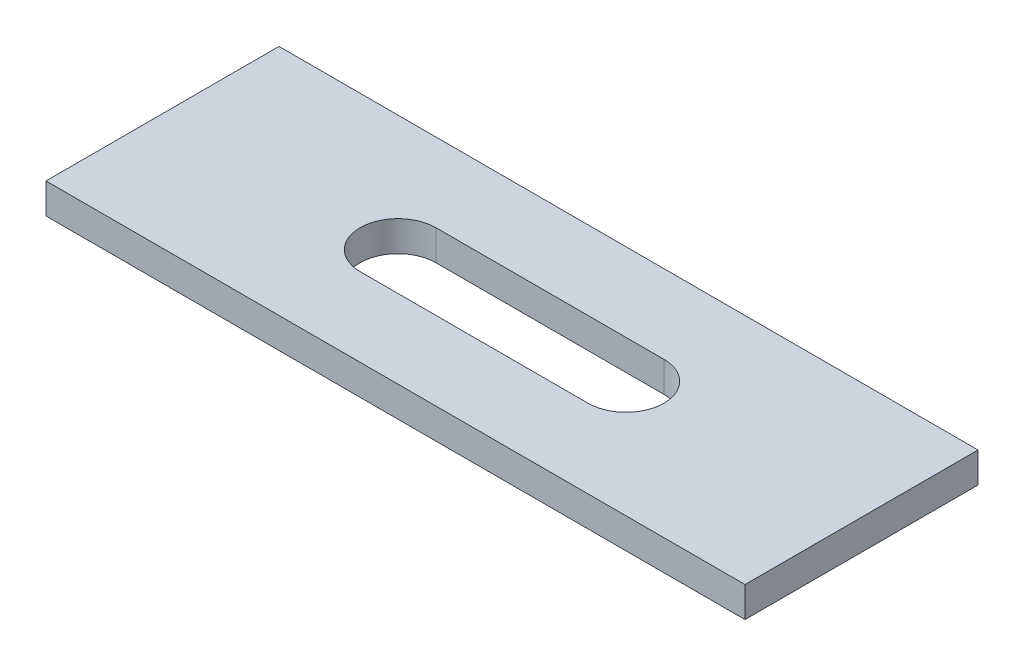
ISO-10303-21;
HEADER;
FILE_DESCRIPTION(('STEP AP214'),'2;1');
FILE_NAME('part.step','',(''),(''),'','','');
FILE_SCHEMA(('AUTOMOTIVE_DESIGN { 1 0 10303 214 1 1 1 1 }'));
ENDSEC;
DATA;
#1=APPLICATION_CONTEXT('core data for automotive mechanical design processes');
#2=APPLICATION_PROTOCOL_DEFINITION('international standard','automotive_design',2000,#1);
#3=PRODUCT_CONTEXT('',#1,'mechanical');
#4=PRODUCT('Part','Part','',(#3));
#5=PRODUCT_RELATED_PRODUCT_CATEGORY('part','',(#4));
#6=PRODUCT_DEFINITION_FORMATION('','',#4);
#7=PRODUCT_DEFINITION_CONTEXT('part definition',#1,'design');
#8=PRODUCT_DEFINITION('design','',#6,#7);
#9=PRODUCT_DEFINITION_SHAPE('','',#8);
#10=(LENGTH_UNIT() NAMED_UNIT(*) SI_UNIT(.MILLI.,.METRE.));
#11=(NAMED_UNIT(*) PLANE_ANGLE_UNIT() SI_UNIT($,.RADIAN.));
#12=(NAMED_UNIT(*) SI_UNIT($,.STERADIAN.) SOLID_ANGLE_UNIT());
#13=UNCERTAINTY_MEASURE_WITH_UNIT(LENGTH_MEASURE(1.E-05),#10,'distance_accuracy_value','');
#14=(GEOMETRIC_REPRESENTATION_CONTEXT(3) GLOBAL_UNCERTAINTY_ASSIGNED_CONTEXT((#13)) GLOBAL_UNIT_ASSIGNED_CONTEXT((#10,
#11,#12)) REPRESENTATION_CONTEXT('',''));
#15=CARTESIAN_POINT('',(0.,0.,0.));
#16=DIRECTION('',(0.,0.,1.));
#17=DIRECTION('',(1.,0.,0.));
#18=AXIS2_PLACEMENT_3D('',#15,#16,#17);
#19=CARTESIAN_POINT('',(0.,12.,0.));
#20=DIRECTION('',(0.,-1.,0.));
#21=DIRECTION('',(0.,0.,-1.));
#22=AXIS2_PLACEMENT_3D('',#19,#20,#21);
#23=PLANE('',#22);
#24=DIRECTION('',(0.,0.,-1.));
#25=VECTOR('',#24,1.);
#26=CARTESIAN_POINT('',(0.,12.,0.));
#27=LINE('',#26,#25);
#28=CARTESIAN_POINT('',(0.,12.,0.));
#29=VERTEX_POINT('',#28);
#30=CARTESIAN_POINT('',(0.,12.,-92.));
#31=VERTEX_POINT('',#30);
#32=EDGE_CURVE('E129',#29,#31,#27,.T.);
#33=ORIENTED_EDGE('',*,*,#32,.F.);
#34=DIRECTION('',(1.,0.,0.));
#35=VECTOR('',#34,1.);
#36=CARTESIAN_POINT('',(0.,12.,0.));
#37=LINE('',#36,#35);
#38=CARTESIAN_POINT('',(276.,12.,0.));
#39=VERTEX_POINT('',#38);
#40=EDGE_CURVE('E138',#29,#39,#37,.T.);
#41=ORIENTED_EDGE('',*,*,#40,.T.);
#42=DIRECTION('',(0.,0.,-1.));
#43=VECTOR('',#42,1.);
#44=CARTESIAN_POINT('',(276.,12.,0.));
#45=LINE('',#44,#43);
#46=CARTESIAN_POINT('',(276.,12.,-92.));
#47=VERTEX_POINT('',#46);
#48=EDGE_CURVE('E136',#39,#47,#45,.T.);
#49=ORIENTED_EDGE('',*,*,#48,.T.);
#50=DIRECTION('',(1.,0.,0.));
#51=VECTOR('',#50,1.);
#52=CARTESIAN_POINT('',(0.,12.,-92.));
#53=LINE('',#52,#51);
#54=EDGE_CURVE('E132',#31,#47,#53,.T.);
#55=ORIENTED_EDGE('',*,*,#54,.F.);
#56=EDGE_LOOP('',(#33,#41,#49,#55));
#57=FACE_BOUND('',#56,.T.);
#58=CARTESIAN_POINT('',(183.,12.,-46.));
#59=DIRECTION('',(0.,-1.,0.));
#60=DIRECTION('',(0.,0.,-1.));
#61=AXIS2_PLACEMENT_3D('',#58,#59,#60);
#62=CIRCLE('',#61,15.);
#63=CARTESIAN_POINT('',(183.,12.,-61.));
#64=VERTEX_POINT('',#63);
#65=CARTESIAN_POINT('',(183.,12.,-31.));
#66=VERTEX_POINT('',#65);
#67=EDGE_CURVE('E105',#64,#66,#62,.T.);
#68=ORIENTED_EDGE('',*,*,#67,.T.);
#69=DIRECTION('',(-1.,0.,0.));
#70=VECTOR('',#69,1.);
#71=CARTESIAN_POINT('',(93.,12.,-31.));
#72=LINE('',#71,#70);
#73=CARTESIAN_POINT('',(93.,12.,-31.));
#74=VERTEX_POINT('',#73);
#75=EDGE_CURVE('E128',#66,#74,#72,.T.);
#76=ORIENTED_EDGE('',*,*,#75,.T.);
#77=CARTESIAN_POINT('',(93.,12.,-46.));
#78=DIRECTION('',(0.,-1.,0.));
#79=DIRECTION('',(0.,0.,-1.));
#80=AXIS2_PLACEMENT_3D('',#77,#78,#79);
#81=CIRCLE('',#80,15.);
#82=CARTESIAN_POINT('',(93.,12.,-61.));
#83=VERTEX_POINT('',#82);
#84=EDGE_CURVE('E177',#74,#83,#81,.T.);
#85=ORIENTED_EDGE('',*,*,#84,.T.);
#86=DIRECTION('',(-1.,0.,0.));
#87=VECTOR('',#86,1.);
#88=CARTESIAN_POINT('',(93.,12.,-61.));
#89=LINE('',#88,#87);
#90=EDGE_CURVE('E144',#64,#83,#89,.T.);
#91=ORIENTED_EDGE('',*,*,#90,.F.);
#92=EDGE_LOOP('',(#68,#76,#85,#91));
#93=FACE_BOUND('',#92,.T.);
#94=ADVANCED_FACE('F33',(#57,#93),#23,.F.);
#95=CARTESIAN_POINT('',(0.,0.,0.));
#96=DIRECTION('',(0.,-1.,0.));
#97=DIRECTION('',(0.,0.,-1.));
#98=AXIS2_PLACEMENT_3D('',#95,#96,#97);
#99=PLANE('',#98);
#100=DIRECTION('',(0.,0.,-1.));
#101=VECTOR('',#100,1.);
#102=CARTESIAN_POINT('',(0.,0.,0.));
#103=LINE('',#102,#101);
#104=CARTESIAN_POINT('',(0.,0.,0.));
#105=VERTEX_POINT('',#104);
#106=CARTESIAN_POINT('',(0.,0.,-92.));
#107=VERTEX_POINT('',#106);
#108=EDGE_CURVE('E140',#105,#107,#103,.T.);
#109=ORIENTED_EDGE('',*,*,#108,.T.);
#110=DIRECTION('',(1.,0.,0.));
#111=VECTOR('',#110,1.);
#112=CARTESIAN_POINT('',(0.,0.,-92.));
#113=LINE('',#112,#111);
#114=CARTESIAN_POINT('',(276.,0.,-92.));
#115=VERTEX_POINT('',#114);
#116=EDGE_CURVE('E143',#107,#115,#113,.T.);
#117=ORIENTED_EDGE('',*,*,#116,.T.);
#118=DIRECTION('',(0.,0.,-1.));
#119=VECTOR('',#118,1.);
#120=CARTESIAN_POINT('',(276.,0.,0.));
#121=LINE('',#120,#119);
#122=CARTESIAN_POINT('',(276.,0.,0.));
#123=VERTEX_POINT('',#122);
#124=EDGE_CURVE('E147',#123,#115,#121,.T.);
#125=ORIENTED_EDGE('',*,*,#124,.F.);
#126=DIRECTION('',(1.,0.,0.));
#127=VECTOR('',#126,1.);
#128=CARTESIAN_POINT('',(0.,0.,0.));
#129=LINE('',#128,#127);
#130=EDGE_CURVE('E133',#105,#123,#129,.T.);
#131=ORIENTED_EDGE('',*,*,#130,.F.);
#132=EDGE_LOOP('',(#109,#117,#125,#131));
#133=FACE_BOUND('',#132,.T.);
#134=DIRECTION('',(1.,0.,0.));
#135=VECTOR('',#134,1.);
#136=CARTESIAN_POINT('',(93.,0.,-31.));
#137=LINE('',#136,#135);
#138=CARTESIAN_POINT('',(93.,0.,-31.));
#139=VERTEX_POINT('',#138);
#140=CARTESIAN_POINT('',(183.,0.,-31.));
#141=VERTEX_POINT('',#140);
#142=EDGE_CURVE('E117',#139,#141,#137,.T.);
#143=ORIENTED_EDGE('',*,*,#142,.T.);
#144=CARTESIAN_POINT('',(183.,0.,-46.));
#145=DIRECTION('',(0.,1.,0.));
#146=DIRECTION('',(0.,0.,1.));
#147=AXIS2_PLACEMENT_3D('',#144,#145,#146);
#148=CIRCLE('',#147,15.);
#149=CARTESIAN_POINT('',(183.,0.,-61.));
#150=VERTEX_POINT('',#149);
#151=EDGE_CURVE('E102',#141,#150,#148,.T.);
#152=ORIENTED_EDGE('',*,*,#151,.T.);
#153=DIRECTION('',(1.,0.,0.));
#154=VECTOR('',#153,1.);
#155=CARTESIAN_POINT('',(93.,0.,-61.));
#156=LINE('',#155,#154);
#157=CARTESIAN_POINT('',(93.,0.,-61.));
#158=VERTEX_POINT('',#157);
#159=EDGE_CURVE('E110',#158,#150,#156,.T.);
#160=ORIENTED_EDGE('',*,*,#159,.F.);
#161=CARTESIAN_POINT('',(93.,0.,-46.));
#162=DIRECTION('',(0.,1.,0.));
#163=DIRECTION('',(0.,0.,1.));
#164=AXIS2_PLACEMENT_3D('',#161,#162,#163);
#165=CIRCLE('',#164,15.);
#166=EDGE_CURVE('E58',#158,#139,#165,.T.);
#167=ORIENTED_EDGE('',*,*,#166,.T.);
#168=EDGE_LOOP('',(#143,#152,#160,#167));
#169=FACE_BOUND('',#168,.T.);
#170=ADVANCED_FACE('F115',(#133,#169),#99,.T.);
#171=CARTESIAN_POINT('',(0.,12.,0.));
#172=DIRECTION('',(-1.,0.,0.));
#173=DIRECTION('',(0.,0.,1.));
#174=AXIS2_PLACEMENT_3D('',#171,#172,#173);
#175=PLANE('',#174);
#176=ORIENTED_EDGE('',*,*,#108,.F.);
#177=DIRECTION('',(0.,-1.,0.));
#178=VECTOR('',#177,1.);
#179=CARTESIAN_POINT('',(0.,12.,0.));
#180=LINE('',#179,#178);
#181=EDGE_CURVE('E11',#29,#105,#180,.T.);
#182=ORIENTED_EDGE('',*,*,#181,.F.);
#183=ORIENTED_EDGE('',*,*,#32,.T.);
#184=DIRECTION('',(0.,-1.,0.));
#185=VECTOR('',#184,1.);
#186=CARTESIAN_POINT('',(0.,12.,-92.));
#187=LINE('',#186,#185);
#188=EDGE_CURVE('E37',#31,#107,#187,.T.);
#189=ORIENTED_EDGE('',*,*,#188,.T.);
#190=EDGE_LOOP('',(#176,#182,#183,#189));
#191=FACE_BOUND('',#190,.T.);
#192=ADVANCED_FACE('F35',(#191),#175,.T.);
#193=CARTESIAN_POINT('',(0.,12.,0.));
#194=DIRECTION('',(0.,0.,-1.));
#195=DIRECTION('',(-1.,0.,0.));
#196=AXIS2_PLACEMENT_3D('',#193,#194,#195);
#197=PLANE('',#196);
#198=ORIENTED_EDGE('',*,*,#130,.T.);
#199=DIRECTION('',(0.,-1.,0.));
#200=VECTOR('',#199,1.);
#201=CARTESIAN_POINT('',(276.,12.,0.));
#202=LINE('',#201,#200);
#203=EDGE_CURVE('E42',#39,#123,#202,.T.);
#204=ORIENTED_EDGE('',*,*,#203,.F.);
#205=ORIENTED_EDGE('',*,*,#40,.F.);
#206=ORIENTED_EDGE('',*,*,#181,.T.);
#207=EDGE_LOOP('',(#198,#204,#205,#206));
#208=FACE_BOUND('',#207,.T.);
#209=ADVANCED_FACE('F166',(#208),#197,.F.);
#210=CARTESIAN_POINT('',(276.,12.,0.));
#211=DIRECTION('',(-1.,0.,0.));
#212=DIRECTION('',(0.,0.,1.));
#213=AXIS2_PLACEMENT_3D('',#210,#211,#212);
#214=PLANE('',#213);
#215=ORIENTED_EDGE('',*,*,#124,.T.);
#216=DIRECTION('',(0.,-1.,0.));
#217=VECTOR('',#216,1.);
#218=CARTESIAN_POINT('',(276.,12.,-92.));
#219=LINE('',#218,#217);
#220=EDGE_CURVE('E152',#47,#115,#219,.T.);
#221=ORIENTED_EDGE('',*,*,#220,.F.);
#222=ORIENTED_EDGE('',*,*,#48,.F.);
#223=ORIENTED_EDGE('',*,*,#203,.T.);
#224=EDGE_LOOP('',(#215,#221,#222,#223));
#225=FACE_BOUND('',#224,.T.);
#226=ADVANCED_FACE('F170',(#225),#214,.F.);
#227=CARTESIAN_POINT('',(0.,12.,-92.));
#228=DIRECTION('',(0.,0.,-1.));
#229=DIRECTION('',(-1.,0.,0.));
#230=AXIS2_PLACEMENT_3D('',#227,#228,#229);
#231=PLANE('',#230);
#232=ORIENTED_EDGE('',*,*,#116,.F.);
#233=ORIENTED_EDGE('',*,*,#188,.F.);
#234=ORIENTED_EDGE('',*,*,#54,.T.);
#235=ORIENTED_EDGE('',*,*,#220,.T.);
#236=EDGE_LOOP('',(#232,#233,#234,#235));
#237=FACE_BOUND('',#236,.T.);
#238=ADVANCED_FACE('F160',(#237),#231,.T.);
#239=CARTESIAN_POINT('',(183.,135.69316876853,-46.));
#240=DIRECTION('',(0.,-1.,0.));
#241=DIRECTION('',(0.,0.,-1.));
#242=AXIS2_PLACEMENT_3D('',#239,#240,#241);
#243=CYLINDRICAL_SURFACE('',#242,15.);
#244=DIRECTION('',(0.,-1.,0.));
#245=VECTOR('',#244,1.);
#246=CARTESIAN_POINT('',(183.,135.69316876853,-61.));
#247=LINE('',#246,#245);
#248=EDGE_CURVE('E50',#64,#150,#247,.T.);
#249=ORIENTED_EDGE('',*,*,#248,.T.);
#250=ORIENTED_EDGE('',*,*,#151,.F.);
#251=DIRECTION('',(0.,-1.,0.));
#252=VECTOR('',#251,1.);
#253=CARTESIAN_POINT('',(183.,135.69316876853,-31.));
#254=LINE('',#253,#252);
#255=EDGE_CURVE('E107',#66,#141,#254,.T.);
#256=ORIENTED_EDGE('',*,*,#255,.F.);
#257=ORIENTED_EDGE('',*,*,#67,.F.);
#258=EDGE_LOOP('',(#249,#250,#256,#257));
#259=FACE_BOUND('',#258,.T.);
#260=ADVANCED_FACE('F99',(#259),#243,.F.);
#261=CARTESIAN_POINT('',(93.,135.69316876853,-31.));
#262=DIRECTION('',(0.,0.,-1.));
#263=DIRECTION('',(-1.,0.,0.));
#264=AXIS2_PLACEMENT_3D('',#261,#262,#263);
#265=PLANE('',#264);
#266=ORIENTED_EDGE('',*,*,#255,.T.);
#267=ORIENTED_EDGE('',*,*,#142,.F.);
#268=DIRECTION('',(0.,-1.,0.));
#269=VECTOR('',#268,1.);
#270=CARTESIAN_POINT('',(93.,135.69316876853,-31.));
#271=LINE('',#270,#269);
#272=EDGE_CURVE('E124',#74,#139,#271,.T.);
#273=ORIENTED_EDGE('',*,*,#272,.F.);
#274=ORIENTED_EDGE('',*,*,#75,.F.);
#275=EDGE_LOOP('',(#266,#267,#273,#274));
#276=FACE_BOUND('',#275,.T.);
#277=ADVANCED_FACE('F183',(#276),#265,.T.);
#278=CARTESIAN_POINT('',(93.,135.69316876853,-46.));
#279=DIRECTION('',(0.,-1.,0.));
#280=DIRECTION('',(0.,0.,-1.));
#281=AXIS2_PLACEMENT_3D('',#278,#279,#280);
#282=CYLINDRICAL_SURFACE('',#281,15.);
#283=ORIENTED_EDGE('',*,*,#272,.T.);
#284=ORIENTED_EDGE('',*,*,#166,.F.);
#285=DIRECTION('',(0.,-1.,0.));
#286=VECTOR('',#285,1.);
#287=CARTESIAN_POINT('',(93.,135.69316876853,-61.));
#288=LINE('',#287,#286);
#289=EDGE_CURVE('E112',#83,#158,#288,.T.);
#290=ORIENTED_EDGE('',*,*,#289,.F.);
#291=ORIENTED_EDGE('',*,*,#84,.F.);
#292=EDGE_LOOP('',(#283,#284,#290,#291));
#293=FACE_BOUND('',#292,.T.);
#294=ADVANCED_FACE('F180',(#293),#282,.F.);
#295=CARTESIAN_POINT('',(93.,135.69316876853,-61.));
#296=DIRECTION('',(0.,0.,-1.));
#297=DIRECTION('',(-1.,0.,0.));
#298=AXIS2_PLACEMENT_3D('',#295,#296,#297);
#299=PLANE('',#298);
#300=ORIENTED_EDGE('',*,*,#90,.T.);
#301=ORIENTED_EDGE('',*,*,#289,.T.);
#302=ORIENTED_EDGE('',*,*,#159,.T.);
#303=ORIENTED_EDGE('',*,*,#248,.F.);
#304=EDGE_LOOP('',(#300,#301,#302,#303));
#305=FACE_BOUND('',#304,.T.);
#306=ADVANCED_FACE('F111',(#305),#299,.F.);
#307=CLOSED_SHELL('',(#94,#170,#192,#209,#226,#238,#260,#277,#294,#306));
#308=MANIFOLD_SOLID_BREP('B2',#307);
#309=ADVANCED_BREP_SHAPE_REPRESENTATION('',(#18,#308),#14);
#310=SHAPE_DEFINITION_REPRESENTATION(#9,#309);
ENDSEC;
END-ISO-10303-21;
